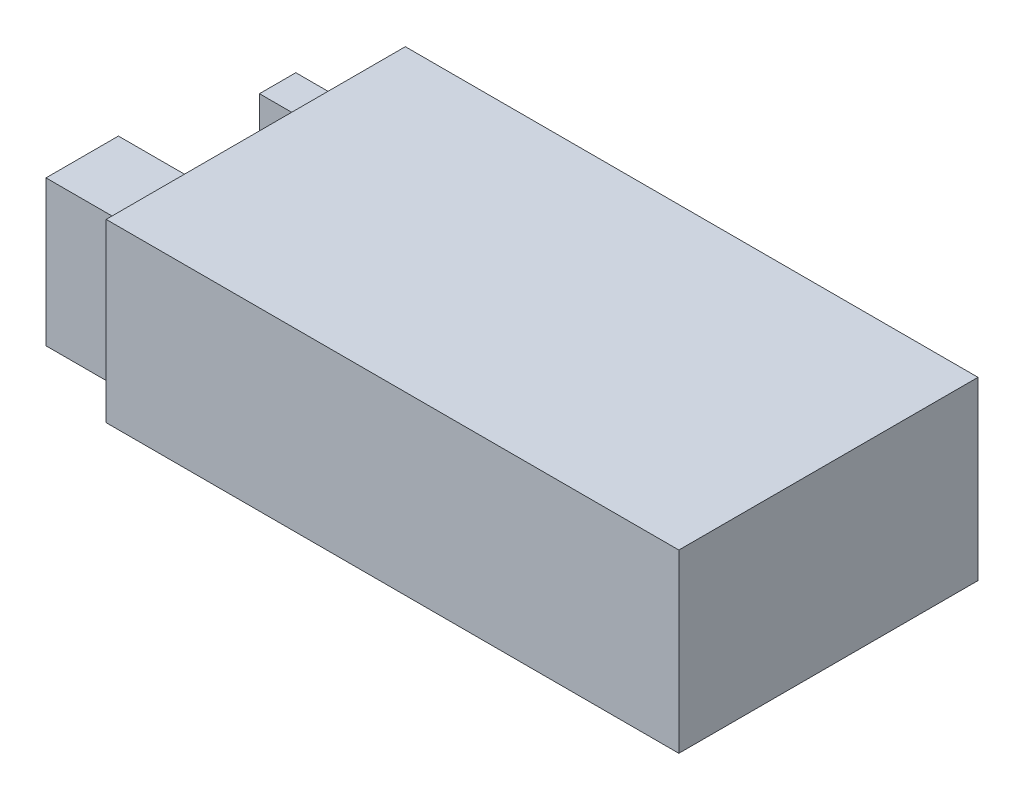
ISO-10303-21;
HEADER;
FILE_DESCRIPTION(('STEP AP214'),'2;1');
FILE_NAME('part.step','',(''),(''),'','','');
FILE_SCHEMA(('AUTOMOTIVE_DESIGN { 1 0 10303 214 1 1 1 1 }'));
ENDSEC;
DATA;
#1=APPLICATION_CONTEXT('core data for automotive mechanical design processes');
#2=APPLICATION_PROTOCOL_DEFINITION('international standard','automotive_design',2000,#1);
#3=PRODUCT_CONTEXT('',#1,'mechanical');
#4=PRODUCT('Part','Part','',(#3));
#5=PRODUCT_RELATED_PRODUCT_CATEGORY('part','',(#4));
#6=PRODUCT_DEFINITION_FORMATION('','',#4);
#7=PRODUCT_DEFINITION_CONTEXT('part definition',#1,'design');
#8=PRODUCT_DEFINITION('design','',#6,#7);
#9=PRODUCT_DEFINITION_SHAPE('','',#8);
#10=(LENGTH_UNIT() NAMED_UNIT(*) SI_UNIT(.MILLI.,.METRE.));
#11=(NAMED_UNIT(*) PLANE_ANGLE_UNIT() SI_UNIT($,.RADIAN.));
#12=(NAMED_UNIT(*) SI_UNIT($,.STERADIAN.) SOLID_ANGLE_UNIT());
#13=UNCERTAINTY_MEASURE_WITH_UNIT(LENGTH_MEASURE(1.E-05),#10,'distance_accuracy_value','');
#14=(GEOMETRIC_REPRESENTATION_CONTEXT(3) GLOBAL_UNCERTAINTY_ASSIGNED_CONTEXT((#13)) GLOBAL_UNIT_ASSIGNED_CONTEXT((#10,
#11,#12)) REPRESENTATION_CONTEXT('',''));
#15=CARTESIAN_POINT('',(0.,0.,0.));
#16=DIRECTION('',(0.,0.,1.));
#17=DIRECTION('',(1.,0.,0.));
#18=AXIS2_PLACEMENT_3D('',#15,#16,#17);
#19=CARTESIAN_POINT('',(-33.5,20.6,-17.5));
#20=DIRECTION('',(1.,0.,0.));
#21=DIRECTION('',(0.,0.,-1.));
#22=AXIS2_PLACEMENT_3D('',#19,#20,#21);
#23=PLANE('',#22);
#24=DIRECTION('',(0.,-1.,0.));
#25=VECTOR('',#24,1.);
#26=CARTESIAN_POINT('',(-33.5,4.08451343217699,-14.687786710868));
#27=LINE('',#26,#25);
#28=CARTESIAN_POINT('',(-33.5,14.3696638241702,-14.687786710868));
#29=VERTEX_POINT('',#28);
#30=CARTESIAN_POINT('',(-33.5,4.08451343217699,-14.687786710868));
#31=VERTEX_POINT('',#30);
#32=EDGE_CURVE('E145',#29,#31,#27,.T.);
#33=ORIENTED_EDGE('',*,*,#32,.F.);
#34=DIRECTION('',(0.,0.,-1.));
#35=VECTOR('',#34,1.);
#36=CARTESIAN_POINT('',(-33.5,14.3696638241702,-14.687786710868));
#37=LINE('',#36,#35);
#38=CARTESIAN_POINT('',(-33.5,14.3696638241702,-10.4331381674176));
#39=VERTEX_POINT('',#38);
#40=EDGE_CURVE('E158',#39,#29,#37,.T.);
#41=ORIENTED_EDGE('',*,*,#40,.F.);
#42=DIRECTION('',(0.,1.,0.));
#43=VECTOR('',#42,1.);
#44=CARTESIAN_POINT('',(-33.5,4.08451343217699,-10.4331381674176));
#45=LINE('',#44,#43);
#46=CARTESIAN_POINT('',(-33.5,4.08451343217699,-10.4331381674176));
#47=VERTEX_POINT('',#46);
#48=EDGE_CURVE('E167',#47,#39,#45,.T.);
#49=ORIENTED_EDGE('',*,*,#48,.F.);
#50=DIRECTION('',(0.,0.,1.));
#51=VECTOR('',#50,1.);
#52=CARTESIAN_POINT('',(-33.5,4.08451343217699,-14.687786710868));
#53=LINE('',#52,#51);
#54=EDGE_CURVE('E148',#31,#47,#53,.T.);
#55=ORIENTED_EDGE('',*,*,#54,.F.);
#56=EDGE_LOOP('',(#33,#41,#49,#55));
#57=FACE_BOUND('',#56,.T.);
#58=DIRECTION('',(0.,0.,1.));
#59=VECTOR('',#58,1.);
#60=CARTESIAN_POINT('',(-33.5,0.,-17.5));
#61=LINE('',#60,#59);
#62=CARTESIAN_POINT('',(-33.5,0.,-17.5));
#63=VERTEX_POINT('',#62);
#64=CARTESIAN_POINT('',(-33.5,0.,17.5));
#65=VERTEX_POINT('',#64);
#66=EDGE_CURVE('E199',#63,#65,#61,.T.);
#67=ORIENTED_EDGE('',*,*,#66,.T.);
#68=DIRECTION('',(0.,-1.,0.));
#69=VECTOR('',#68,1.);
#70=CARTESIAN_POINT('',(-33.5,20.6,17.5));
#71=LINE('',#70,#69);
#72=CARTESIAN_POINT('',(-33.5,20.6,17.5));
#73=VERTEX_POINT('',#72);
#74=EDGE_CURVE('E204',#73,#65,#71,.T.);
#75=ORIENTED_EDGE('',*,*,#74,.F.);
#76=DIRECTION('',(0.,0.,1.));
#77=VECTOR('',#76,1.);
#78=CARTESIAN_POINT('',(-33.5,20.6,-17.5));
#79=LINE('',#78,#77);
#80=CARTESIAN_POINT('',(-33.5,20.6,-17.5));
#81=VERTEX_POINT('',#80);
#82=EDGE_CURVE('E190',#81,#73,#79,.T.);
#83=ORIENTED_EDGE('',*,*,#82,.F.);
#84=DIRECTION('',(0.,-1.,0.));
#85=VECTOR('',#84,1.);
#86=CARTESIAN_POINT('',(-33.5,20.6,-17.5));
#87=LINE('',#86,#85);
#88=EDGE_CURVE('E43',#81,#63,#87,.T.);
#89=ORIENTED_EDGE('',*,*,#88,.T.);
#90=EDGE_LOOP('',(#67,#75,#83,#89));
#91=FACE_BOUND('',#90,.T.);
#92=DIRECTION('',(0.,-1.,0.));
#93=VECTOR('',#92,1.);
#94=CARTESIAN_POINT('',(-33.5,1.30974264297018,6.06749879239889));
#95=LINE('',#94,#93);
#96=CARTESIAN_POINT('',(-33.5,18.3283368167719,6.06749879239889));
#97=VERTEX_POINT('',#96);
#98=CARTESIAN_POINT('',(-33.5,1.30974264297018,6.06749879239889));
#99=VERTEX_POINT('',#98);
#100=EDGE_CURVE('E144',#97,#99,#95,.T.);
#101=ORIENTED_EDGE('',*,*,#100,.F.);
#102=DIRECTION('',(0.,0.,-1.));
#103=VECTOR('',#102,1.);
#104=CARTESIAN_POINT('',(-33.5,18.3283368167719,6.06749879239889));
#105=LINE('',#104,#103);
#106=CARTESIAN_POINT('',(-33.5,18.3283368167719,14.5397989354437));
#107=VERTEX_POINT('',#106);
#108=EDGE_CURVE('E141',#107,#97,#105,.T.);
#109=ORIENTED_EDGE('',*,*,#108,.F.);
#110=DIRECTION('',(0.,1.,0.));
#111=VECTOR('',#110,1.);
#112=CARTESIAN_POINT('',(-33.5,1.30974264297018,14.5397989354437));
#113=LINE('',#112,#111);
#114=CARTESIAN_POINT('',(-33.5,1.30974264297018,14.5397989354437));
#115=VERTEX_POINT('',#114);
#116=EDGE_CURVE('E55',#115,#107,#113,.T.);
#117=ORIENTED_EDGE('',*,*,#116,.F.);
#118=DIRECTION('',(0.,0.,1.));
#119=VECTOR('',#118,1.);
#120=CARTESIAN_POINT('',(-33.5,1.30974264297018,6.06749879239889));
#121=LINE('',#120,#119);
#122=EDGE_CURVE('E50',#99,#115,#121,.T.);
#123=ORIENTED_EDGE('',*,*,#122,.F.);
#124=EDGE_LOOP('',(#101,#109,#117,#123));
#125=FACE_BOUND('',#124,.T.);
#126=ADVANCED_FACE('F35',(#57,#91,#125),#23,.F.);
#127=CARTESIAN_POINT('',(33.5,20.6,-17.5));
#128=DIRECTION('',(-1.,0.,0.));
#129=DIRECTION('',(0.,0.,1.));
#130=AXIS2_PLACEMENT_3D('',#127,#128,#129);
#131=PLANE('',#130);
#132=DIRECTION('',(0.,0.,-1.));
#133=VECTOR('',#132,1.);
#134=CARTESIAN_POINT('',(33.5,0.,-17.5));
#135=LINE('',#134,#133);
#136=CARTESIAN_POINT('',(33.5,0.,17.5));
#137=VERTEX_POINT('',#136);
#138=CARTESIAN_POINT('',(33.5,0.,-17.5));
#139=VERTEX_POINT('',#138);
#140=EDGE_CURVE('E183',#137,#139,#135,.T.);
#141=ORIENTED_EDGE('',*,*,#140,.T.);
#142=DIRECTION('',(0.,-1.,0.));
#143=VECTOR('',#142,1.);
#144=CARTESIAN_POINT('',(33.5,20.6,-17.5));
#145=LINE('',#144,#143);
#146=CARTESIAN_POINT('',(33.5,20.6,-17.5));
#147=VERTEX_POINT('',#146);
#148=EDGE_CURVE('E11',#147,#139,#145,.T.);
#149=ORIENTED_EDGE('',*,*,#148,.F.);
#150=DIRECTION('',(0.,0.,-1.));
#151=VECTOR('',#150,1.);
#152=CARTESIAN_POINT('',(33.5,20.6,-17.5));
#153=LINE('',#152,#151);
#154=CARTESIAN_POINT('',(33.5,20.6,17.5));
#155=VERTEX_POINT('',#154);
#156=EDGE_CURVE('E184',#155,#147,#153,.T.);
#157=ORIENTED_EDGE('',*,*,#156,.F.);
#158=DIRECTION('',(0.,-1.,0.));
#159=VECTOR('',#158,1.);
#160=CARTESIAN_POINT('',(33.5,20.6,17.5));
#161=LINE('',#160,#159);
#162=EDGE_CURVE('E194',#155,#137,#161,.T.);
#163=ORIENTED_EDGE('',*,*,#162,.T.);
#164=EDGE_LOOP('',(#141,#149,#157,#163));
#165=FACE_BOUND('',#164,.T.);
#166=ADVANCED_FACE('F37',(#165),#131,.F.);
#167=CARTESIAN_POINT('',(-33.5,20.6,-17.5));
#168=DIRECTION('',(0.,0.,1.));
#169=DIRECTION('',(1.,0.,0.));
#170=AXIS2_PLACEMENT_3D('',#167,#168,#169);
#171=PLANE('',#170);
#172=DIRECTION('',(-1.,0.,0.));
#173=VECTOR('',#172,1.);
#174=CARTESIAN_POINT('',(-33.5,0.,-17.5));
#175=LINE('',#174,#173);
#176=EDGE_CURVE('E197',#139,#63,#175,.T.);
#177=ORIENTED_EDGE('',*,*,#176,.T.);
#178=ORIENTED_EDGE('',*,*,#88,.F.);
#179=DIRECTION('',(-1.,0.,0.));
#180=VECTOR('',#179,1.);
#181=CARTESIAN_POINT('',(-33.5,20.6,-17.5));
#182=LINE('',#181,#180);
#183=EDGE_CURVE('E187',#147,#81,#182,.T.);
#184=ORIENTED_EDGE('',*,*,#183,.F.);
#185=ORIENTED_EDGE('',*,*,#148,.T.);
#186=EDGE_LOOP('',(#177,#178,#184,#185));
#187=FACE_BOUND('',#186,.T.);
#188=ADVANCED_FACE('F226',(#187),#171,.F.);
#189=CARTESIAN_POINT('',(-33.5,20.6,17.5));
#190=DIRECTION('',(0.,0.,-1.));
#191=DIRECTION('',(-1.,0.,0.));
#192=AXIS2_PLACEMENT_3D('',#189,#190,#191);
#193=PLANE('',#192);
#194=DIRECTION('',(1.,0.,0.));
#195=VECTOR('',#194,1.);
#196=CARTESIAN_POINT('',(-33.5,0.,17.5));
#197=LINE('',#196,#195);
#198=EDGE_CURVE('E188',#65,#137,#197,.T.);
#199=ORIENTED_EDGE('',*,*,#198,.T.);
#200=ORIENTED_EDGE('',*,*,#162,.F.);
#201=DIRECTION('',(1.,0.,0.));
#202=VECTOR('',#201,1.);
#203=CARTESIAN_POINT('',(-33.5,20.6,17.5));
#204=LINE('',#203,#202);
#205=EDGE_CURVE('E192',#73,#155,#204,.T.);
#206=ORIENTED_EDGE('',*,*,#205,.F.);
#207=ORIENTED_EDGE('',*,*,#74,.T.);
#208=EDGE_LOOP('',(#199,#200,#206,#207));
#209=FACE_BOUND('',#208,.T.);
#210=ADVANCED_FACE('F219',(#209),#193,.F.);
#211=CARTESIAN_POINT('',(0.,20.6,0.));
#212=DIRECTION('',(0.,1.,0.));
#213=DIRECTION('',(0.,0.,1.));
#214=AXIS2_PLACEMENT_3D('',#211,#212,#213);
#215=PLANE('',#214);
#216=ORIENTED_EDGE('',*,*,#156,.T.);
#217=ORIENTED_EDGE('',*,*,#183,.T.);
#218=ORIENTED_EDGE('',*,*,#82,.T.);
#219=ORIENTED_EDGE('',*,*,#205,.T.);
#220=EDGE_LOOP('',(#216,#217,#218,#219));
#221=FACE_BOUND('',#220,.T.);
#222=ADVANCED_FACE('F225',(#221),#215,.T.);
#223=CARTESIAN_POINT('',(0.,0.,0.));
#224=DIRECTION('',(0.,1.,0.));
#225=DIRECTION('',(0.,0.,1.));
#226=AXIS2_PLACEMENT_3D('',#223,#224,#225);
#227=PLANE('',#226);
#228=ORIENTED_EDGE('',*,*,#140,.F.);
#229=ORIENTED_EDGE('',*,*,#198,.F.);
#230=ORIENTED_EDGE('',*,*,#66,.F.);
#231=ORIENTED_EDGE('',*,*,#176,.F.);
#232=EDGE_LOOP('',(#228,#229,#230,#231));
#233=FACE_BOUND('',#232,.T.);
#234=ADVANCED_FACE('F216',(#233),#227,.F.);
#235=CARTESIAN_POINT('',(-43.5,4.08451343217699,-14.687786710868));
#236=DIRECTION('',(0.,0.,1.));
#237=DIRECTION('',(1.,0.,0.));
#238=AXIS2_PLACEMENT_3D('',#235,#236,#237);
#239=PLANE('',#238);
#240=ORIENTED_EDGE('',*,*,#32,.T.);
#241=DIRECTION('',(1.,0.,0.));
#242=VECTOR('',#241,1.);
#243=CARTESIAN_POINT('',(-43.5,4.08451343217699,-14.687786710868));
#244=LINE('',#243,#242);
#245=CARTESIAN_POINT('',(-43.5,4.08451343217699,-14.687786710868));
#246=VERTEX_POINT('',#245);
#247=EDGE_CURVE('E180',#246,#31,#244,.T.);
#248=ORIENTED_EDGE('',*,*,#247,.F.);
#249=DIRECTION('',(0.,-1.,0.));
#250=VECTOR('',#249,1.);
#251=CARTESIAN_POINT('',(-43.5,4.08451343217699,-14.687786710868));
#252=LINE('',#251,#250);
#253=CARTESIAN_POINT('',(-43.5,14.3696638241702,-14.687786710868));
#254=VERTEX_POINT('',#253);
#255=EDGE_CURVE('E154',#254,#246,#252,.T.);
#256=ORIENTED_EDGE('',*,*,#255,.F.);
#257=DIRECTION('',(1.,0.,0.));
#258=VECTOR('',#257,1.);
#259=CARTESIAN_POINT('',(-43.5,14.3696638241702,-14.687786710868));
#260=LINE('',#259,#258);
#261=EDGE_CURVE('E163',#254,#29,#260,.T.);
#262=ORIENTED_EDGE('',*,*,#261,.T.);
#263=EDGE_LOOP('',(#240,#248,#256,#262));
#264=FACE_BOUND('',#263,.T.);
#265=ADVANCED_FACE('F241',(#264),#239,.F.);
#266=CARTESIAN_POINT('',(-43.5,4.08451343217699,-14.687786710868));
#267=DIRECTION('',(0.,1.,0.));
#268=DIRECTION('',(0.,0.,1.));
#269=AXIS2_PLACEMENT_3D('',#266,#267,#268);
#270=PLANE('',#269);
#271=ORIENTED_EDGE('',*,*,#54,.T.);
#272=DIRECTION('',(1.,0.,0.));
#273=VECTOR('',#272,1.);
#274=CARTESIAN_POINT('',(-43.5,4.08451343217699,-10.4331381674176));
#275=LINE('',#274,#273);
#276=CARTESIAN_POINT('',(-43.5,4.08451343217699,-10.4331381674176));
#277=VERTEX_POINT('',#276);
#278=EDGE_CURVE('E177',#277,#47,#275,.T.);
#279=ORIENTED_EDGE('',*,*,#278,.F.);
#280=DIRECTION('',(0.,0.,1.));
#281=VECTOR('',#280,1.);
#282=CARTESIAN_POINT('',(-43.5,4.08451343217699,-14.687786710868));
#283=LINE('',#282,#281);
#284=EDGE_CURVE('E157',#246,#277,#283,.T.);
#285=ORIENTED_EDGE('',*,*,#284,.F.);
#286=ORIENTED_EDGE('',*,*,#247,.T.);
#287=EDGE_LOOP('',(#271,#279,#285,#286));
#288=FACE_BOUND('',#287,.T.);
#289=ADVANCED_FACE('F246',(#288),#270,.F.);
#290=CARTESIAN_POINT('',(-43.5,4.08451343217699,-10.4331381674176));
#291=DIRECTION('',(0.,0.,-1.));
#292=DIRECTION('',(-1.,0.,0.));
#293=AXIS2_PLACEMENT_3D('',#290,#291,#292);
#294=PLANE('',#293);
#295=ORIENTED_EDGE('',*,*,#48,.T.);
#296=DIRECTION('',(1.,0.,0.));
#297=VECTOR('',#296,1.);
#298=CARTESIAN_POINT('',(-43.5,14.3696638241702,-10.4331381674176));
#299=LINE('',#298,#297);
#300=CARTESIAN_POINT('',(-43.5,14.3696638241702,-10.4331381674176));
#301=VERTEX_POINT('',#300);
#302=EDGE_CURVE('E174',#301,#39,#299,.T.);
#303=ORIENTED_EDGE('',*,*,#302,.F.);
#304=DIRECTION('',(0.,1.,0.));
#305=VECTOR('',#304,1.);
#306=CARTESIAN_POINT('',(-43.5,4.08451343217699,-10.4331381674176));
#307=LINE('',#306,#305);
#308=EDGE_CURVE('E160',#277,#301,#307,.T.);
#309=ORIENTED_EDGE('',*,*,#308,.F.);
#310=ORIENTED_EDGE('',*,*,#278,.T.);
#311=EDGE_LOOP('',(#295,#303,#309,#310));
#312=FACE_BOUND('',#311,.T.);
#313=ADVANCED_FACE('F250',(#312),#294,.F.);
#314=CARTESIAN_POINT('',(-43.5,14.3696638241702,-14.687786710868));
#315=DIRECTION('',(0.,-1.,0.));
#316=DIRECTION('',(0.,0.,-1.));
#317=AXIS2_PLACEMENT_3D('',#314,#315,#316);
#318=PLANE('',#317);
#319=ORIENTED_EDGE('',*,*,#40,.T.);
#320=ORIENTED_EDGE('',*,*,#261,.F.);
#321=DIRECTION('',(0.,0.,-1.));
#322=VECTOR('',#321,1.);
#323=CARTESIAN_POINT('',(-43.5,14.3696638241702,-14.687786710868));
#324=LINE('',#323,#322);
#325=EDGE_CURVE('E162',#301,#254,#324,.T.);
#326=ORIENTED_EDGE('',*,*,#325,.F.);
#327=ORIENTED_EDGE('',*,*,#302,.T.);
#328=EDGE_LOOP('',(#319,#320,#326,#327));
#329=FACE_BOUND('',#328,.T.);
#330=ADVANCED_FACE('F254',(#329),#318,.F.);
#331=CARTESIAN_POINT('',(-43.5,0.,0.));
#332=DIRECTION('',(1.,0.,0.));
#333=DIRECTION('',(0.,0.,-1.));
#334=AXIS2_PLACEMENT_3D('',#331,#332,#333);
#335=PLANE('',#334);
#336=ORIENTED_EDGE('',*,*,#255,.T.);
#337=ORIENTED_EDGE('',*,*,#284,.T.);
#338=ORIENTED_EDGE('',*,*,#308,.T.);
#339=ORIENTED_EDGE('',*,*,#325,.T.);
#340=EDGE_LOOP('',(#336,#337,#338,#339));
#341=FACE_BOUND('',#340,.T.);
#342=ADVANCED_FACE('F258',(#341),#335,.F.);
#343=CARTESIAN_POINT('',(-43.5,1.30974264297018,6.0674987923989));
#344=DIRECTION('',(0.,0.,1.));
#345=DIRECTION('',(1.,0.,0.));
#346=AXIS2_PLACEMENT_3D('',#343,#344,#345);
#347=PLANE('',#346);
#348=ORIENTED_EDGE('',*,*,#100,.T.);
#349=DIRECTION('',(1.,0.,0.));
#350=VECTOR('',#349,1.);
#351=CARTESIAN_POINT('',(-43.5,1.30974264297018,6.0674987923989));
#352=LINE('',#351,#350);
#353=CARTESIAN_POINT('',(-43.5,1.30974264297018,6.0674987923989));
#354=VERTEX_POINT('',#353);
#355=EDGE_CURVE('E125',#354,#99,#352,.T.);
#356=ORIENTED_EDGE('',*,*,#355,.F.);
#357=DIRECTION('',(0.,-1.,0.));
#358=VECTOR('',#357,1.);
#359=CARTESIAN_POINT('',(-43.5,1.30974264297018,6.0674987923989));
#360=LINE('',#359,#358);
#361=CARTESIAN_POINT('',(-43.5,18.3283368167719,6.0674987923989));
#362=VERTEX_POINT('',#361);
#363=EDGE_CURVE('E132',#362,#354,#360,.T.);
#364=ORIENTED_EDGE('',*,*,#363,.F.);
#365=DIRECTION('',(1.,0.,0.));
#366=VECTOR('',#365,1.);
#367=CARTESIAN_POINT('',(-43.5,18.3283368167719,6.0674987923989));
#368=LINE('',#367,#366);
#369=EDGE_CURVE('E370',#362,#97,#368,.T.);
#370=ORIENTED_EDGE('',*,*,#369,.T.);
#371=EDGE_LOOP('',(#348,#356,#364,#370));
#372=FACE_BOUND('',#371,.T.);
#373=ADVANCED_FACE('F143',(#372),#347,.F.);
#374=CARTESIAN_POINT('',(-43.5,1.30974264297018,6.0674987923989));
#375=DIRECTION('',(0.,1.,0.));
#376=DIRECTION('',(0.,0.,1.));
#377=AXIS2_PLACEMENT_3D('',#374,#375,#376);
#378=PLANE('',#377);
#379=ORIENTED_EDGE('',*,*,#122,.T.);
#380=DIRECTION('',(1.,0.,0.));
#381=VECTOR('',#380,1.);
#382=CARTESIAN_POINT('',(-43.5,1.30974264297018,14.5397989354437));
#383=LINE('',#382,#381);
#384=CARTESIAN_POINT('',(-43.5,1.30974264297018,14.5397989354437));
#385=VERTEX_POINT('',#384);
#386=EDGE_CURVE('E128',#385,#115,#383,.T.);
#387=ORIENTED_EDGE('',*,*,#386,.F.);
#388=DIRECTION('',(0.,0.,1.));
#389=VECTOR('',#388,1.);
#390=CARTESIAN_POINT('',(-43.5,1.30974264297018,6.0674987923989));
#391=LINE('',#390,#389);
#392=EDGE_CURVE('E121',#354,#385,#391,.T.);
#393=ORIENTED_EDGE('',*,*,#392,.F.);
#394=ORIENTED_EDGE('',*,*,#355,.T.);
#395=EDGE_LOOP('',(#379,#387,#393,#394));
#396=FACE_BOUND('',#395,.T.);
#397=ADVANCED_FACE('F123',(#396),#378,.F.);
#398=CARTESIAN_POINT('',(-43.5,1.30974264297018,14.5397989354437));
#399=DIRECTION('',(0.,0.,-1.));
#400=DIRECTION('',(-1.,0.,0.));
#401=AXIS2_PLACEMENT_3D('',#398,#399,#400);
#402=PLANE('',#401);
#403=ORIENTED_EDGE('',*,*,#116,.T.);
#404=DIRECTION('',(1.,0.,0.));
#405=VECTOR('',#404,1.);
#406=CARTESIAN_POINT('',(-43.5,18.3283368167719,14.5397989354437));
#407=LINE('',#406,#405);
#408=CARTESIAN_POINT('',(-43.5,18.3283368167719,14.5397989354437));
#409=VERTEX_POINT('',#408);
#410=EDGE_CURVE('E150',#409,#107,#407,.T.);
#411=ORIENTED_EDGE('',*,*,#410,.F.);
#412=DIRECTION('',(0.,1.,0.));
#413=VECTOR('',#412,1.);
#414=CARTESIAN_POINT('',(-43.5,1.30974264297018,14.5397989354437));
#415=LINE('',#414,#413);
#416=EDGE_CURVE('E131',#385,#409,#415,.T.);
#417=ORIENTED_EDGE('',*,*,#416,.F.);
#418=ORIENTED_EDGE('',*,*,#386,.T.);
#419=EDGE_LOOP('',(#403,#411,#417,#418));
#420=FACE_BOUND('',#419,.T.);
#421=ADVANCED_FACE('F267',(#420),#402,.F.);
#422=CARTESIAN_POINT('',(-43.5,18.3283368167719,6.0674987923989));
#423=DIRECTION('',(0.,-1.,0.));
#424=DIRECTION('',(0.,0.,-1.));
#425=AXIS2_PLACEMENT_3D('',#422,#423,#424);
#426=PLANE('',#425);
#427=ORIENTED_EDGE('',*,*,#108,.T.);
#428=ORIENTED_EDGE('',*,*,#369,.F.);
#429=DIRECTION('',(0.,0.,-1.));
#430=VECTOR('',#429,1.);
#431=CARTESIAN_POINT('',(-43.5,18.3283368167719,6.0674987923989));
#432=LINE('',#431,#430);
#433=EDGE_CURVE('E137',#409,#362,#432,.T.);
#434=ORIENTED_EDGE('',*,*,#433,.F.);
#435=ORIENTED_EDGE('',*,*,#410,.T.);
#436=EDGE_LOOP('',(#427,#428,#434,#435));
#437=FACE_BOUND('',#436,.T.);
#438=ADVANCED_FACE('F270',(#437),#426,.F.);
#439=CARTESIAN_POINT('',(-43.5,0.,0.));
#440=DIRECTION('',(1.,0.,0.));
#441=DIRECTION('',(0.,0.,-1.));
#442=AXIS2_PLACEMENT_3D('',#439,#440,#441);
#443=PLANE('',#442);
#444=ORIENTED_EDGE('',*,*,#363,.T.);
#445=ORIENTED_EDGE('',*,*,#392,.T.);
#446=ORIENTED_EDGE('',*,*,#416,.T.);
#447=ORIENTED_EDGE('',*,*,#433,.T.);
#448=EDGE_LOOP('',(#444,#445,#446,#447));
#449=FACE_BOUND('',#448,.T.);
#450=ADVANCED_FACE('F135',(#449),#443,.F.);
#451=CLOSED_SHELL('',(#126,#166,#188,#210,#222,#234,#265,#289,#313,#330,#342,#373,#397,#421,
#438,#450));
#452=MANIFOLD_SOLID_BREP('B2',#451);
#453=ADVANCED_BREP_SHAPE_REPRESENTATION('',(#18,#452),#14);
#454=SHAPE_DEFINITION_REPRESENTATION(#9,#453);
ENDSEC;
END-ISO-10303-21;
